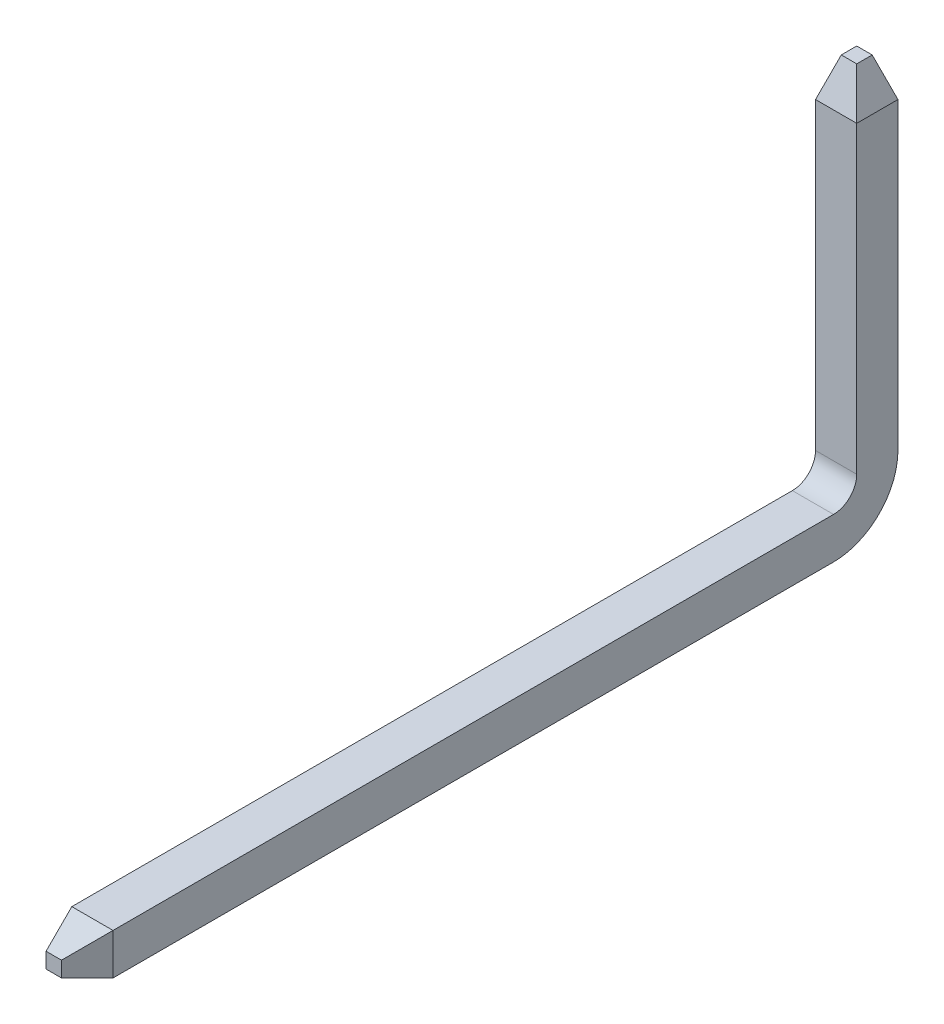
ISO-10303-21;
HEADER;
FILE_DESCRIPTION(('STEP AP214'),'2;1');
FILE_NAME('part.step','',(''),(''),'','','');
FILE_SCHEMA(('AUTOMOTIVE_DESIGN { 1 0 10303 214 1 1 1 1 }'));
ENDSEC;
DATA;
#1=APPLICATION_CONTEXT('core data for automotive mechanical design processes');
#2=APPLICATION_PROTOCOL_DEFINITION('international standard','automotive_design',2000,#1);
#3=PRODUCT_CONTEXT('',#1,'mechanical');
#4=PRODUCT('Part','Part','',(#3));
#5=PRODUCT_RELATED_PRODUCT_CATEGORY('part','',(#4));
#6=PRODUCT_DEFINITION_FORMATION('','',#4);
#7=PRODUCT_DEFINITION_CONTEXT('part definition',#1,'design');
#8=PRODUCT_DEFINITION('design','',#6,#7);
#9=PRODUCT_DEFINITION_SHAPE('','',#8);
#10=(LENGTH_UNIT() NAMED_UNIT(*) SI_UNIT(.MILLI.,.METRE.));
#11=(NAMED_UNIT(*) PLANE_ANGLE_UNIT() SI_UNIT($,.RADIAN.));
#12=(NAMED_UNIT(*) SI_UNIT($,.STERADIAN.) SOLID_ANGLE_UNIT());
#13=UNCERTAINTY_MEASURE_WITH_UNIT(LENGTH_MEASURE(1.E-05),#10,'distance_accuracy_value','');
#14=(GEOMETRIC_REPRESENTATION_CONTEXT(3) GLOBAL_UNCERTAINTY_ASSIGNED_CONTEXT((#13)) GLOBAL_UNIT_ASSIGNED_CONTEXT((#10,
#11,#12)) REPRESENTATION_CONTEXT('',''));
#15=CARTESIAN_POINT('',(0.,0.,0.));
#16=DIRECTION('',(0.,0.,1.));
#17=DIRECTION('',(1.,0.,0.));
#18=AXIS2_PLACEMENT_3D('',#15,#16,#17);
#19=CARTESIAN_POINT('',(0.32,2.66,-6.895));
#20=DIRECTION('',(0.,-1.,0.));
#21=DIRECTION('',(0.,0.,-1.));
#22=AXIS2_PLACEMENT_3D('',#19,#20,#21);
#23=PLANE('',#22);
#24=DIRECTION('',(0.,0.,-1.));
#25=VECTOR('',#24,1.);
#26=CARTESIAN_POINT('',(0.12,2.66,-6.895));
#27=LINE('',#26,#25);
#28=CARTESIAN_POINT('',(0.12,2.66,-6.455));
#29=VERTEX_POINT('',#28);
#30=CARTESIAN_POINT('',(0.12,2.66,-6.695));
#31=VERTEX_POINT('',#30);
#32=EDGE_CURVE('E132',#29,#31,#27,.T.);
#33=ORIENTED_EDGE('',*,*,#32,.T.);
#34=DIRECTION('',(-1.,0.,0.));
#35=VECTOR('',#34,1.);
#36=CARTESIAN_POINT('',(0.32,2.66,-6.695));
#37=LINE('',#36,#35);
#38=CARTESIAN_POINT('',(-0.12,2.66,-6.695));
#39=VERTEX_POINT('',#38);
#40=EDGE_CURVE('E127',#31,#39,#37,.T.);
#41=ORIENTED_EDGE('',*,*,#40,.T.);
#42=DIRECTION('',(0.,0.,1.));
#43=VECTOR('',#42,1.);
#44=CARTESIAN_POINT('',(-0.12,2.66,-6.895));
#45=LINE('',#44,#43);
#46=CARTESIAN_POINT('',(-0.12,2.66,-6.455));
#47=VERTEX_POINT('',#46);
#48=EDGE_CURVE('E21',#39,#47,#45,.T.);
#49=ORIENTED_EDGE('',*,*,#48,.T.);
#50=DIRECTION('',(1.,0.,0.));
#51=VECTOR('',#50,1.);
#52=CARTESIAN_POINT('',(0.32,2.66,-6.455));
#53=LINE('',#52,#51);
#54=EDGE_CURVE('E164',#47,#29,#53,.T.);
#55=ORIENTED_EDGE('',*,*,#54,.T.);
#56=EDGE_LOOP('',(#33,#41,#49,#55));
#57=FACE_BOUND('',#56,.T.);
#58=ADVANCED_FACE('F17',(#57),#23,.F.);
#59=CARTESIAN_POINT('',(0.32,-2.66,-6.255));
#60=DIRECTION('',(0.,0.,-1.));
#61=DIRECTION('',(0.,-1.,0.));
#62=AXIS2_PLACEMENT_3D('',#59,#60,#61);
#63=PLANE('',#62);
#64=DIRECTION('',(0.,-1.,0.));
#65=VECTOR('',#64,1.);
#66=CARTESIAN_POINT('',(0.32,-2.66,-6.255));
#67=LINE('',#66,#65);
#68=CARTESIAN_POINT('',(0.32,2.06,-6.255));
#69=VERTEX_POINT('',#68);
#70=CARTESIAN_POINT('',(0.32,-2.66,-6.255));
#71=VERTEX_POINT('',#70);
#72=EDGE_CURVE('E272',#69,#71,#67,.T.);
#73=ORIENTED_EDGE('',*,*,#72,.F.);
#74=DIRECTION('',(-1.,0.,0.));
#75=VECTOR('',#74,1.);
#76=CARTESIAN_POINT('',(0.32,2.06,-6.255));
#77=LINE('',#76,#75);
#78=CARTESIAN_POINT('',(-0.32,2.06,-6.255));
#79=VERTEX_POINT('',#78);
#80=EDGE_CURVE('E208',#69,#79,#77,.T.);
#81=ORIENTED_EDGE('',*,*,#80,.T.);
#82=DIRECTION('',(0.,-1.,0.));
#83=VECTOR('',#82,1.);
#84=CARTESIAN_POINT('',(-0.32,-2.66,-6.255));
#85=LINE('',#84,#83);
#86=CARTESIAN_POINT('',(-0.32,-2.66,-6.255));
#87=VERTEX_POINT('',#86);
#88=EDGE_CURVE('E190',#79,#87,#85,.T.);
#89=ORIENTED_EDGE('',*,*,#88,.T.);
#90=DIRECTION('',(-1.,0.,0.));
#91=VECTOR('',#90,1.);
#92=CARTESIAN_POINT('',(0.32,-2.66,-6.255));
#93=LINE('',#92,#91);
#94=EDGE_CURVE('E224',#71,#87,#93,.T.);
#95=ORIENTED_EDGE('',*,*,#94,.F.);
#96=EDGE_LOOP('',(#73,#81,#89,#95));
#97=FACE_BOUND('',#96,.T.);
#98=ADVANCED_FACE('F342',(#97),#63,.F.);
#99=CARTESIAN_POINT('',(0.32,-2.66,-6.895));
#100=DIRECTION('',(0.,0.,1.));
#101=DIRECTION('',(1.,0.,0.));
#102=AXIS2_PLACEMENT_3D('',#99,#100,#101);
#103=PLANE('',#102);
#104=DIRECTION('',(0.,1.,0.));
#105=VECTOR('',#104,1.);
#106=CARTESIAN_POINT('',(-0.32,-2.66,-6.895));
#107=LINE('',#106,#105);
#108=CARTESIAN_POINT('',(-0.32,-2.66,-6.895));
#109=VERTEX_POINT('',#108);
#110=CARTESIAN_POINT('',(-0.32,2.06,-6.895));
#111=VERTEX_POINT('',#110);
#112=EDGE_CURVE('E186',#109,#111,#107,.T.);
#113=ORIENTED_EDGE('',*,*,#112,.T.);
#114=DIRECTION('',(1.,0.,0.));
#115=VECTOR('',#114,1.);
#116=CARTESIAN_POINT('',(0.32,2.06,-6.895));
#117=LINE('',#116,#115);
#118=CARTESIAN_POINT('',(0.32,2.06,-6.895));
#119=VERTEX_POINT('',#118);
#120=EDGE_CURVE('E138',#111,#119,#117,.T.);
#121=ORIENTED_EDGE('',*,*,#120,.T.);
#122=DIRECTION('',(0.,1.,0.));
#123=VECTOR('',#122,1.);
#124=CARTESIAN_POINT('',(0.32,-2.66,-6.895));
#125=LINE('',#124,#123);
#126=CARTESIAN_POINT('',(0.32,-2.66,-6.895));
#127=VERTEX_POINT('',#126);
#128=EDGE_CURVE('E262',#127,#119,#125,.T.);
#129=ORIENTED_EDGE('',*,*,#128,.F.);
#130=DIRECTION('',(-1.,0.,0.));
#131=VECTOR('',#130,1.);
#132=CARTESIAN_POINT('',(0.32,-2.66,-6.895));
#133=LINE('',#132,#131);
#134=EDGE_CURVE('E198',#127,#109,#133,.T.);
#135=ORIENTED_EDGE('',*,*,#134,.T.);
#136=EDGE_LOOP('',(#113,#121,#129,#135));
#137=FACE_BOUND('',#136,.T.);
#138=ADVANCED_FACE('F260',(#137),#103,.F.);
#139=CARTESIAN_POINT('',(0.32,-3.66,5.895));
#140=DIRECTION('',(0.,0.,-1.));
#141=DIRECTION('',(0.,-1.,0.));
#142=AXIS2_PLACEMENT_3D('',#139,#140,#141);
#143=PLANE('',#142);
#144=DIRECTION('',(0.,1.,0.));
#145=VECTOR('',#144,1.);
#146=CARTESIAN_POINT('',(0.12,-3.02,5.895));
#147=LINE('',#146,#145);
#148=CARTESIAN_POINT('',(0.12,-3.46,5.895));
#149=VERTEX_POINT('',#148);
#150=CARTESIAN_POINT('',(0.12,-3.22,5.895));
#151=VERTEX_POINT('',#150);
#152=EDGE_CURVE('E211',#149,#151,#147,.T.);
#153=ORIENTED_EDGE('',*,*,#152,.T.);
#154=DIRECTION('',(-1.,0.,0.));
#155=VECTOR('',#154,1.);
#156=CARTESIAN_POINT('',(0.32,-3.22,5.895));
#157=LINE('',#156,#155);
#158=CARTESIAN_POINT('',(-0.12,-3.22,5.895));
#159=VERTEX_POINT('',#158);
#160=EDGE_CURVE('E11',#151,#159,#157,.T.);
#161=ORIENTED_EDGE('',*,*,#160,.T.);
#162=DIRECTION('',(0.,-1.,0.));
#163=VECTOR('',#162,1.);
#164=CARTESIAN_POINT('',(-0.12,-3.66,5.895));
#165=LINE('',#164,#163);
#166=CARTESIAN_POINT('',(-0.12,-3.46,5.895));
#167=VERTEX_POINT('',#166);
#168=EDGE_CURVE('E175',#159,#167,#165,.T.);
#169=ORIENTED_EDGE('',*,*,#168,.T.);
#170=DIRECTION('',(1.,0.,0.));
#171=VECTOR('',#170,1.);
#172=CARTESIAN_POINT('',(0.32,-3.46,5.895));
#173=LINE('',#172,#171);
#174=EDGE_CURVE('E176',#167,#149,#173,.T.);
#175=ORIENTED_EDGE('',*,*,#174,.T.);
#176=EDGE_LOOP('',(#153,#161,#169,#175));
#177=FACE_BOUND('',#176,.T.);
#178=ADVANCED_FACE('F322',(#177),#143,.F.);
#179=CARTESIAN_POINT('',(0.32,-3.66,5.895));
#180=DIRECTION('',(0.,1.,0.));
#181=DIRECTION('',(1.,0.,0.));
#182=AXIS2_PLACEMENT_3D('',#179,#180,#181);
#183=PLANE('',#182);
#184=DIRECTION('',(0.,0.,-1.));
#185=VECTOR('',#184,1.);
#186=CARTESIAN_POINT('',(0.32,-3.66,5.895));
#187=LINE('',#186,#185);
#188=CARTESIAN_POINT('',(0.32,-3.66,5.295));
#189=VERTEX_POINT('',#188);
#190=CARTESIAN_POINT('',(0.32,-3.66,-5.895));
#191=VERTEX_POINT('',#190);
#192=EDGE_CURVE('E220',#189,#191,#187,.T.);
#193=ORIENTED_EDGE('',*,*,#192,.F.);
#194=DIRECTION('',(-1.,0.,0.));
#195=VECTOR('',#194,1.);
#196=CARTESIAN_POINT('',(0.32,-3.66,5.295));
#197=LINE('',#196,#195);
#198=CARTESIAN_POINT('',(-0.32,-3.66,5.295));
#199=VERTEX_POINT('',#198);
#200=EDGE_CURVE('E170',#189,#199,#197,.T.);
#201=ORIENTED_EDGE('',*,*,#200,.T.);
#202=DIRECTION('',(0.,0.,-1.));
#203=VECTOR('',#202,1.);
#204=CARTESIAN_POINT('',(-0.32,-3.66,5.895));
#205=LINE('',#204,#203);
#206=CARTESIAN_POINT('',(-0.32,-3.66,-5.895));
#207=VERTEX_POINT('',#206);
#208=EDGE_CURVE('E215',#199,#207,#205,.T.);
#209=ORIENTED_EDGE('',*,*,#208,.T.);
#210=DIRECTION('',(-1.,0.,0.));
#211=VECTOR('',#210,1.);
#212=CARTESIAN_POINT('',(0.32,-3.66,-5.895));
#213=LINE('',#212,#211);
#214=EDGE_CURVE('E185',#191,#207,#213,.T.);
#215=ORIENTED_EDGE('',*,*,#214,.F.);
#216=EDGE_LOOP('',(#193,#201,#209,#215));
#217=FACE_BOUND('',#216,.T.);
#218=ADVANCED_FACE('F343',(#217),#183,.F.);
#219=CARTESIAN_POINT('',(0.32,-3.22,5.895));
#220=DIRECTION('',(0.,-0.948683298050514,-0.316227766016838));
#221=DIRECTION('',(0.,0.316227766016838,-0.948683298050514));
#222=AXIS2_PLACEMENT_3D('',#219,#220,#221);
#223=PLANE('',#222);
#224=DIRECTION('',(0.301511344578037,0.301511344578037,-0.904534033733109));
#225=VECTOR('',#224,1.);
#226=CARTESIAN_POINT('',(0.352727272727,-2.987272727273,5.196818181818));
#227=LINE('',#226,#225);
#228=CARTESIAN_POINT('',(0.32,-3.02,5.295));
#229=VERTEX_POINT('',#228);
#230=EDGE_CURVE('E168',#151,#229,#227,.T.);
#231=ORIENTED_EDGE('',*,*,#230,.T.);
#232=DIRECTION('',(1.,0.,0.));
#233=VECTOR('',#232,1.);
#234=CARTESIAN_POINT('',(0.32,-3.02,5.295));
#235=LINE('',#234,#233);
#236=CARTESIAN_POINT('',(-0.32,-3.02,5.295));
#237=VERTEX_POINT('',#236);
#238=EDGE_CURVE('E199',#237,#229,#235,.T.);
#239=ORIENTED_EDGE('',*,*,#238,.F.);
#240=DIRECTION('',(0.301511344578037,-0.301511344578037,0.904534033733109));
#241=VECTOR('',#240,1.);
#242=CARTESIAN_POINT('',(-0.08,-3.26,6.015));
#243=LINE('',#242,#241);
#244=EDGE_CURVE('E28',#237,#159,#243,.T.);
#245=ORIENTED_EDGE('',*,*,#244,.T.);
#246=ORIENTED_EDGE('',*,*,#160,.F.);
#247=EDGE_LOOP('',(#231,#239,#245,#246));
#248=FACE_BOUND('',#247,.T.);
#249=ADVANCED_FACE('F333',(#248),#223,.F.);
#250=CARTESIAN_POINT('',(-0.12,-3.66,5.895));
#251=DIRECTION('',(0.948683298050514,0.,-0.316227766016838));
#252=DIRECTION('',(0.,-1.,0.));
#253=AXIS2_PLACEMENT_3D('',#250,#251,#252);
#254=PLANE('',#253);
#255=DIRECTION('',(0.301511344578037,0.301511344578037,0.904534033733109));
#256=VECTOR('',#255,1.);
#257=CARTESIAN_POINT('',(-0.261818181818,-3.601818181818,5.469545454545));
#258=LINE('',#257,#256);
#259=EDGE_CURVE('E137',#199,#167,#258,.T.);
#260=ORIENTED_EDGE('',*,*,#259,.T.);
#261=ORIENTED_EDGE('',*,*,#168,.F.);
#262=ORIENTED_EDGE('',*,*,#244,.F.);
#263=DIRECTION('',(0.,1.,0.));
#264=VECTOR('',#263,1.);
#265=CARTESIAN_POINT('',(-0.32,-2.66,5.295));
#266=LINE('',#265,#264);
#267=EDGE_CURVE('E193',#199,#237,#266,.T.);
#268=ORIENTED_EDGE('',*,*,#267,.F.);
#269=EDGE_LOOP('',(#260,#261,#262,#268));
#270=FACE_BOUND('',#269,.T.);
#271=ADVANCED_FACE('F316',(#270),#254,.F.);
#272=CARTESIAN_POINT('',(0.32,-2.66,5.295));
#273=DIRECTION('',(0.948683298050514,0.,0.316227766016838));
#274=DIRECTION('',(0.,-1.,0.));
#275=AXIS2_PLACEMENT_3D('',#272,#273,#274);
#276=PLANE('',#275);
#277=DIRECTION('',(0.301511344578037,-0.301511344578037,-0.904534033733109));
#278=VECTOR('',#277,1.);
#279=CARTESIAN_POINT('',(0.32,-3.66,5.295));
#280=LINE('',#279,#278);
#281=EDGE_CURVE('E172',#149,#189,#280,.T.);
#282=ORIENTED_EDGE('',*,*,#281,.T.);
#283=DIRECTION('',(0.,-1.,0.));
#284=VECTOR('',#283,1.);
#285=CARTESIAN_POINT('',(0.32,-3.66,5.295));
#286=LINE('',#285,#284);
#287=EDGE_CURVE('E216',#229,#189,#286,.T.);
#288=ORIENTED_EDGE('',*,*,#287,.F.);
#289=ORIENTED_EDGE('',*,*,#230,.F.);
#290=ORIENTED_EDGE('',*,*,#152,.F.);
#291=EDGE_LOOP('',(#282,#288,#289,#290));
#292=FACE_BOUND('',#291,.T.);
#293=ADVANCED_FACE('F328',(#292),#276,.T.);
#294=CARTESIAN_POINT('',(0.32,-3.66,5.295));
#295=DIRECTION('',(0.,0.948683298050514,-0.316227766016838));
#296=DIRECTION('',(-1.,0.,0.));
#297=AXIS2_PLACEMENT_3D('',#294,#295,#296);
#298=PLANE('',#297);
#299=ORIENTED_EDGE('',*,*,#259,.F.);
#300=ORIENTED_EDGE('',*,*,#200,.F.);
#301=ORIENTED_EDGE('',*,*,#281,.F.);
#302=ORIENTED_EDGE('',*,*,#174,.F.);
#303=EDGE_LOOP('',(#299,#300,#301,#302));
#304=FACE_BOUND('',#303,.T.);
#305=ADVANCED_FACE('F320',(#304),#298,.F.);
#306=CARTESIAN_POINT('',(0.32,2.66,-6.695));
#307=DIRECTION('',(0.,-0.316227766016838,0.948683298050514));
#308=DIRECTION('',(-1.,0.,0.));
#309=AXIS2_PLACEMENT_3D('',#306,#307,#308);
#310=PLANE('',#309);
#311=DIRECTION('',(0.301511344578037,-0.904534033733109,-0.301511344578037));
#312=VECTOR('',#311,1.);
#313=CARTESIAN_POINT('',(0.229090909091,2.332727272727,-6.804090909091));
#314=LINE('',#313,#312);
#315=EDGE_CURVE('E158',#31,#119,#314,.T.);
#316=ORIENTED_EDGE('',*,*,#315,.T.);
#317=ORIENTED_EDGE('',*,*,#120,.F.);
#318=DIRECTION('',(0.301511344578037,0.904534033733109,0.301511344578037));
#319=VECTOR('',#318,1.);
#320=CARTESIAN_POINT('',(-0.138181818182,2.605454545455,-6.713181818182));
#321=LINE('',#320,#319);
#322=EDGE_CURVE('E141',#111,#39,#321,.T.);
#323=ORIENTED_EDGE('',*,*,#322,.T.);
#324=ORIENTED_EDGE('',*,*,#40,.F.);
#325=EDGE_LOOP('',(#316,#317,#323,#324));
#326=FACE_BOUND('',#325,.T.);
#327=ADVANCED_FACE('F142',(#326),#310,.F.);
#328=CARTESIAN_POINT('',(-0.12,2.66,-6.895));
#329=DIRECTION('',(0.948683298050514,-0.316227766016838,0.));
#330=DIRECTION('',(0.,0.,-1.));
#331=AXIS2_PLACEMENT_3D('',#328,#329,#330);
#332=PLANE('',#331);
#333=DIRECTION('',(0.301511344578037,0.904534033733109,-0.301511344578037));
#334=VECTOR('',#333,1.);
#335=CARTESIAN_POINT('',(-0.261818181818,2.234545454545,-6.313181818182));
#336=LINE('',#335,#334);
#337=EDGE_CURVE('E152',#79,#47,#336,.T.);
#338=ORIENTED_EDGE('',*,*,#337,.T.);
#339=ORIENTED_EDGE('',*,*,#48,.F.);
#340=ORIENTED_EDGE('',*,*,#322,.F.);
#341=DIRECTION('',(0.,0.,-1.));
#342=VECTOR('',#341,1.);
#343=CARTESIAN_POINT('',(-0.32,2.06,-5.895));
#344=LINE('',#343,#342);
#345=EDGE_CURVE('E188',#79,#111,#344,.T.);
#346=ORIENTED_EDGE('',*,*,#345,.F.);
#347=EDGE_LOOP('',(#338,#339,#340,#346));
#348=FACE_BOUND('',#347,.T.);
#349=ADVANCED_FACE('F150',(#348),#332,.F.);
#350=CARTESIAN_POINT('',(0.32,2.06,-5.895));
#351=DIRECTION('',(0.948683298050514,0.316227766016838,0.));
#352=DIRECTION('',(0.,0.,-1.));
#353=AXIS2_PLACEMENT_3D('',#350,#351,#352);
#354=PLANE('',#353);
#355=DIRECTION('',(0.301511344578037,-0.904534033733109,0.301511344578037));
#356=VECTOR('',#355,1.);
#357=CARTESIAN_POINT('',(0.352727272727,1.961818181818,-6.222272727273));
#358=LINE('',#357,#356);
#359=EDGE_CURVE('E205',#29,#69,#358,.T.);
#360=ORIENTED_EDGE('',*,*,#359,.T.);
#361=DIRECTION('',(0.,0.,1.));
#362=VECTOR('',#361,1.);
#363=CARTESIAN_POINT('',(0.32,2.06,-6.255));
#364=LINE('',#363,#362);
#365=EDGE_CURVE('E266',#119,#69,#364,.T.);
#366=ORIENTED_EDGE('',*,*,#365,.F.);
#367=ORIENTED_EDGE('',*,*,#315,.F.);
#368=ORIENTED_EDGE('',*,*,#32,.F.);
#369=EDGE_LOOP('',(#360,#366,#367,#368));
#370=FACE_BOUND('',#369,.T.);
#371=ADVANCED_FACE('F267',(#370),#354,.T.);
#372=CARTESIAN_POINT('',(0.32,2.06,-6.255));
#373=DIRECTION('',(0.,-0.316227766016838,-0.948683298050514));
#374=DIRECTION('',(0.,-0.948683298050514,0.316227766016838));
#375=AXIS2_PLACEMENT_3D('',#372,#373,#374);
#376=PLANE('',#375);
#377=ORIENTED_EDGE('',*,*,#337,.F.);
#378=ORIENTED_EDGE('',*,*,#80,.F.);
#379=ORIENTED_EDGE('',*,*,#359,.F.);
#380=ORIENTED_EDGE('',*,*,#54,.F.);
#381=EDGE_LOOP('',(#377,#378,#379,#380));
#382=FACE_BOUND('',#381,.T.);
#383=ADVANCED_FACE('F19',(#382),#376,.F.);
#384=CARTESIAN_POINT('',(-0.32,-2.66,-5.895));
#385=DIRECTION('',(1.,0.,0.));
#386=DIRECTION('',(0.,1.,0.));
#387=AXIS2_PLACEMENT_3D('',#384,#385,#386);
#388=PLANE('',#387);
#389=ORIENTED_EDGE('',*,*,#208,.F.);
#390=ORIENTED_EDGE('',*,*,#267,.T.);
#391=DIRECTION('',(0.,0.,1.));
#392=VECTOR('',#391,1.);
#393=CARTESIAN_POINT('',(-0.32,-3.02,5.895));
#394=LINE('',#393,#392);
#395=CARTESIAN_POINT('',(-0.32,-3.02,-5.895));
#396=VERTEX_POINT('',#395);
#397=EDGE_CURVE('E204',#396,#237,#394,.T.);
#398=ORIENTED_EDGE('',*,*,#397,.F.);
#399=CARTESIAN_POINT('',(-0.32,-2.66,-5.895));
#400=DIRECTION('',(-1.,0.,0.));
#401=DIRECTION('',(0.,1.,0.));
#402=AXIS2_PLACEMENT_3D('',#399,#400,#401);
#403=CIRCLE('',#402,0.36);
#404=EDGE_CURVE('E180',#87,#396,#403,.T.);
#405=ORIENTED_EDGE('',*,*,#404,.F.);
#406=ORIENTED_EDGE('',*,*,#88,.F.);
#407=ORIENTED_EDGE('',*,*,#345,.T.);
#408=ORIENTED_EDGE('',*,*,#112,.F.);
#409=CARTESIAN_POINT('',(-0.32,-2.66,-5.895));
#410=DIRECTION('',(1.,0.,0.));
#411=DIRECTION('',(0.,1.,0.));
#412=AXIS2_PLACEMENT_3D('',#409,#410,#411);
#413=CIRCLE('',#412,1.);
#414=EDGE_CURVE('E233',#207,#109,#413,.T.);
#415=ORIENTED_EDGE('',*,*,#414,.F.);
#416=EDGE_LOOP('',(#389,#390,#398,#405,#406,#407,#408,#415));
#417=FACE_BOUND('',#416,.T.);
#418=ADVANCED_FACE('F257',(#417),#388,.F.);
#419=CARTESIAN_POINT('',(0.32,-2.66,-5.895));
#420=DIRECTION('',(1.,0.,0.));
#421=DIRECTION('',(0.,1.,0.));
#422=AXIS2_PLACEMENT_3D('',#419,#420,#421);
#423=PLANE('',#422);
#424=DIRECTION('',(0.,0.,1.));
#425=VECTOR('',#424,1.);
#426=CARTESIAN_POINT('',(0.32,-3.02,5.895));
#427=LINE('',#426,#425);
#428=CARTESIAN_POINT('',(0.32,-3.02,-5.895));
#429=VERTEX_POINT('',#428);
#430=EDGE_CURVE('E203',#429,#229,#427,.T.);
#431=ORIENTED_EDGE('',*,*,#430,.T.);
#432=ORIENTED_EDGE('',*,*,#287,.T.);
#433=ORIENTED_EDGE('',*,*,#192,.T.);
#434=CARTESIAN_POINT('',(0.32,-2.66,-5.895));
#435=DIRECTION('',(1.,0.,0.));
#436=DIRECTION('',(0.,1.,0.));
#437=AXIS2_PLACEMENT_3D('',#434,#435,#436);
#438=CIRCLE('',#437,1.);
#439=EDGE_CURVE('E194',#191,#127,#438,.T.);
#440=ORIENTED_EDGE('',*,*,#439,.T.);
#441=ORIENTED_EDGE('',*,*,#128,.T.);
#442=ORIENTED_EDGE('',*,*,#365,.T.);
#443=ORIENTED_EDGE('',*,*,#72,.T.);
#444=CARTESIAN_POINT('',(0.32,-2.66,-5.895));
#445=DIRECTION('',(-1.,0.,0.));
#446=DIRECTION('',(0.,1.,0.));
#447=AXIS2_PLACEMENT_3D('',#444,#445,#446);
#448=CIRCLE('',#447,0.36);
#449=EDGE_CURVE('E228',#71,#429,#448,.T.);
#450=ORIENTED_EDGE('',*,*,#449,.T.);
#451=EDGE_LOOP('',(#431,#432,#433,#440,#441,#442,#443,#450));
#452=FACE_BOUND('',#451,.T.);
#453=ADVANCED_FACE('F274',(#452),#423,.T.);
#454=CARTESIAN_POINT('',(0.32,-3.02,5.895));
#455=DIRECTION('',(0.,-1.,0.));
#456=DIRECTION('',(-1.,0.,0.));
#457=AXIS2_PLACEMENT_3D('',#454,#455,#456);
#458=PLANE('',#457);
#459=ORIENTED_EDGE('',*,*,#397,.T.);
#460=ORIENTED_EDGE('',*,*,#238,.T.);
#461=ORIENTED_EDGE('',*,*,#430,.F.);
#462=DIRECTION('',(-1.,0.,0.));
#463=VECTOR('',#462,1.);
#464=CARTESIAN_POINT('',(0.32,-3.02,-5.895));
#465=LINE('',#464,#463);
#466=EDGE_CURVE('E184',#429,#396,#465,.T.);
#467=ORIENTED_EDGE('',*,*,#466,.T.);
#468=EDGE_LOOP('',(#459,#460,#461,#467));
#469=FACE_BOUND('',#468,.T.);
#470=ADVANCED_FACE('F337',(#469),#458,.F.);
#471=CARTESIAN_POINT('',(0.32,-2.66,-5.895));
#472=DIRECTION('',(1.,0.,0.));
#473=DIRECTION('',(0.,0.,1.));
#474=AXIS2_PLACEMENT_3D('',#471,#472,#473);
#475=CYLINDRICAL_SURFACE('',#474,0.36);
#476=ORIENTED_EDGE('',*,*,#404,.T.);
#477=ORIENTED_EDGE('',*,*,#466,.F.);
#478=ORIENTED_EDGE('',*,*,#449,.F.);
#479=ORIENTED_EDGE('',*,*,#94,.T.);
#480=EDGE_LOOP('',(#476,#477,#478,#479));
#481=FACE_BOUND('',#480,.T.);
#482=ADVANCED_FACE('F340',(#481),#475,.F.);
#483=CARTESIAN_POINT('',(0.32,-2.66,-5.895));
#484=DIRECTION('',(1.,0.,0.));
#485=DIRECTION('',(0.,0.,1.));
#486=AXIS2_PLACEMENT_3D('',#483,#484,#485);
#487=CYLINDRICAL_SURFACE('',#486,1.);
#488=ORIENTED_EDGE('',*,*,#414,.T.);
#489=ORIENTED_EDGE('',*,*,#134,.F.);
#490=ORIENTED_EDGE('',*,*,#439,.F.);
#491=ORIENTED_EDGE('',*,*,#214,.T.);
#492=EDGE_LOOP('',(#488,#489,#490,#491));
#493=FACE_BOUND('',#492,.T.);
#494=ADVANCED_FACE('F252',(#493),#487,.T.);
#495=CLOSED_SHELL('',(#58,#98,#138,#178,#218,#249,#271,#293,#305,#327,#349,#371,#383,#418,#453,
#470,#482,#494));
#496=MANIFOLD_SOLID_BREP('B1',#495);
#497=ADVANCED_BREP_SHAPE_REPRESENTATION('',(#18,#496),#14);
#498=SHAPE_DEFINITION_REPRESENTATION(#9,#497);
ENDSEC;
END-ISO-10303-21;
